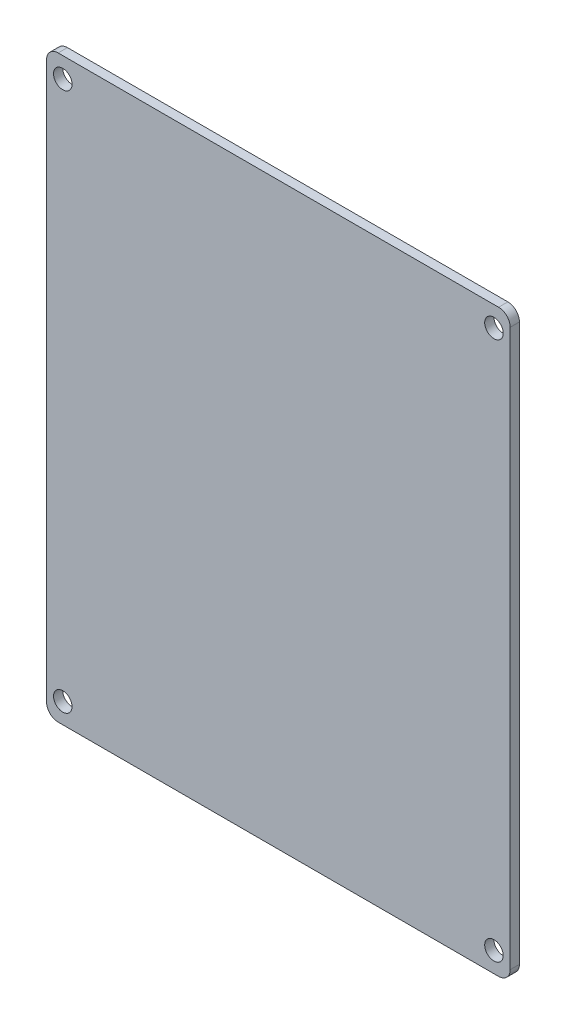
ISO-10303-21;
HEADER;
FILE_DESCRIPTION(('STEP AP214'),'2;1');
FILE_NAME('part.step','',(''),(''),'','','');
FILE_SCHEMA(('AUTOMOTIVE_DESIGN { 1 0 10303 214 1 1 1 1 }'));
ENDSEC;
DATA;
#1=APPLICATION_CONTEXT('core data for automotive mechanical design processes');
#2=APPLICATION_PROTOCOL_DEFINITION('international standard','automotive_design',2000,#1);
#3=PRODUCT_CONTEXT('',#1,'mechanical');
#4=PRODUCT('Part','Part','',(#3));
#5=PRODUCT_RELATED_PRODUCT_CATEGORY('part','',(#4));
#6=PRODUCT_DEFINITION_FORMATION('','',#4);
#7=PRODUCT_DEFINITION_CONTEXT('part definition',#1,'design');
#8=PRODUCT_DEFINITION('design','',#6,#7);
#9=PRODUCT_DEFINITION_SHAPE('','',#8);
#10=(LENGTH_UNIT() NAMED_UNIT(*) SI_UNIT(.MILLI.,.METRE.));
#11=(NAMED_UNIT(*) PLANE_ANGLE_UNIT() SI_UNIT($,.RADIAN.));
#12=(NAMED_UNIT(*) SI_UNIT($,.STERADIAN.) SOLID_ANGLE_UNIT());
#13=UNCERTAINTY_MEASURE_WITH_UNIT(LENGTH_MEASURE(1.E-05),#10,'distance_accuracy_value','');
#14=(GEOMETRIC_REPRESENTATION_CONTEXT(3) GLOBAL_UNCERTAINTY_ASSIGNED_CONTEXT((#13)) GLOBAL_UNIT_ASSIGNED_CONTEXT((#10,
#11,#12)) REPRESENTATION_CONTEXT('',''));
#15=CARTESIAN_POINT('',(0.,0.,0.));
#16=DIRECTION('',(0.,0.,1.));
#17=DIRECTION('',(1.,0.,0.));
#18=AXIS2_PLACEMENT_3D('',#15,#16,#17);
#19=CARTESIAN_POINT('',(0.,0.,1.6));
#20=DIRECTION('',(0.,0.,-1.));
#21=DIRECTION('',(-1.,0.,0.));
#22=AXIS2_PLACEMENT_3D('',#19,#20,#21);
#23=PLANE('',#22);
#24=DIRECTION('',(-1.,0.,0.));
#25=VECTOR('',#24,1.);
#26=CARTESIAN_POINT('',(-40.,50.,1.6));
#27=LINE('',#26,#25);
#28=CARTESIAN_POINT('',(38.,50.,1.6));
#29=VERTEX_POINT('',#28);
#30=CARTESIAN_POINT('',(-38.,50.,1.6));
#31=VERTEX_POINT('',#30);
#32=EDGE_CURVE('E182',#29,#31,#27,.T.);
#33=ORIENTED_EDGE('',*,*,#32,.T.);
#34=CARTESIAN_POINT('',(-38.,48.,1.6));
#35=DIRECTION('',(0.,0.,-1.));
#36=DIRECTION('',(-1.,0.,0.));
#37=AXIS2_PLACEMENT_3D('',#34,#35,#36);
#38=CIRCLE('',#37,2.);
#39=CARTESIAN_POINT('',(-40.,48.,1.6));
#40=VERTEX_POINT('',#39);
#41=EDGE_CURVE('E161',#31,#40,#38,.F.);
#42=ORIENTED_EDGE('',*,*,#41,.T.);
#43=DIRECTION('',(0.,-1.,0.));
#44=VECTOR('',#43,1.);
#45=CARTESIAN_POINT('',(-40.,-50.,1.6));
#46=LINE('',#45,#44);
#47=CARTESIAN_POINT('',(-40.,-48.,1.6));
#48=VERTEX_POINT('',#47);
#49=EDGE_CURVE('E128',#40,#48,#46,.T.);
#50=ORIENTED_EDGE('',*,*,#49,.T.);
#51=CARTESIAN_POINT('',(-38.,-48.,1.6));
#52=DIRECTION('',(0.,0.,-1.));
#53=DIRECTION('',(-1.,0.,0.));
#54=AXIS2_PLACEMENT_3D('',#51,#52,#53);
#55=CIRCLE('',#54,2.);
#56=CARTESIAN_POINT('',(-38.,-50.,1.6));
#57=VERTEX_POINT('',#56);
#58=EDGE_CURVE('E64',#48,#57,#55,.F.);
#59=ORIENTED_EDGE('',*,*,#58,.T.);
#60=DIRECTION('',(1.,0.,0.));
#61=VECTOR('',#60,1.);
#62=CARTESIAN_POINT('',(-40.,-50.,1.6));
#63=LINE('',#62,#61);
#64=CARTESIAN_POINT('',(38.,-50.,1.6));
#65=VERTEX_POINT('',#64);
#66=EDGE_CURVE('E144',#57,#65,#63,.T.);
#67=ORIENTED_EDGE('',*,*,#66,.T.);
#68=CARTESIAN_POINT('',(38.,-48.,1.6));
#69=DIRECTION('',(0.,0.,-1.));
#70=DIRECTION('',(-1.,0.,0.));
#71=AXIS2_PLACEMENT_3D('',#68,#69,#70);
#72=CIRCLE('',#71,2.);
#73=CARTESIAN_POINT('',(40.,-48.,1.6));
#74=VERTEX_POINT('',#73);
#75=EDGE_CURVE('E156',#65,#74,#72,.F.);
#76=ORIENTED_EDGE('',*,*,#75,.T.);
#77=DIRECTION('',(0.,1.,0.));
#78=VECTOR('',#77,1.);
#79=CARTESIAN_POINT('',(40.,-50.,1.6));
#80=LINE('',#79,#78);
#81=CARTESIAN_POINT('',(40.,48.,1.6));
#82=VERTEX_POINT('',#81);
#83=EDGE_CURVE('E138',#74,#82,#80,.T.);
#84=ORIENTED_EDGE('',*,*,#83,.T.);
#85=CARTESIAN_POINT('',(38.,48.,1.6));
#86=DIRECTION('',(0.,0.,-1.));
#87=DIRECTION('',(-1.,0.,0.));
#88=AXIS2_PLACEMENT_3D('',#85,#86,#87);
#89=CIRCLE('',#88,2.);
#90=EDGE_CURVE('E153',#82,#29,#89,.F.);
#91=ORIENTED_EDGE('',*,*,#90,.T.);
#92=EDGE_LOOP('',(#33,#42,#50,#59,#67,#76,#84,#91));
#93=FACE_BOUND('',#92,.T.);
#94=CARTESIAN_POINT('',(-37.2,46.5,1.6));
#95=DIRECTION('',(0.,0.,1.));
#96=DIRECTION('',(1.,0.,0.));
#97=AXIS2_PLACEMENT_3D('',#94,#95,#96);
#98=CIRCLE('',#97,1.6);
#99=CARTESIAN_POINT('',(-35.6,46.5,1.6));
#100=VERTEX_POINT('',#99);
#101=EDGE_CURVE('E187',#100,#100,#98,.T.);
#102=ORIENTED_EDGE('',*,*,#101,.F.);
#103=EDGE_LOOP('',(#102));
#104=FACE_BOUND('',#103,.T.);
#105=CARTESIAN_POINT('',(37.2,46.5,1.6));
#106=DIRECTION('',(0.,0.,1.));
#107=DIRECTION('',(-1.,0.,0.));
#108=AXIS2_PLACEMENT_3D('',#105,#106,#107);
#109=CIRCLE('',#108,1.6);
#110=CARTESIAN_POINT('',(35.6,46.5,1.6));
#111=VERTEX_POINT('',#110);
#112=EDGE_CURVE('E265',#111,#111,#109,.T.);
#113=ORIENTED_EDGE('',*,*,#112,.F.);
#114=EDGE_LOOP('',(#113));
#115=FACE_BOUND('',#114,.T.);
#116=CARTESIAN_POINT('',(37.2,-46.5,1.6));
#117=DIRECTION('',(0.,0.,1.));
#118=DIRECTION('',(1.,0.,0.));
#119=AXIS2_PLACEMENT_3D('',#116,#117,#118);
#120=CIRCLE('',#119,1.6);
#121=CARTESIAN_POINT('',(38.8,-46.5,1.6));
#122=VERTEX_POINT('',#121);
#123=EDGE_CURVE('E269',#122,#122,#120,.T.);
#124=ORIENTED_EDGE('',*,*,#123,.F.);
#125=EDGE_LOOP('',(#124));
#126=FACE_BOUND('',#125,.T.);
#127=CARTESIAN_POINT('',(-37.2,-46.5,1.6));
#128=DIRECTION('',(0.,0.,1.));
#129=DIRECTION('',(-1.,0.,0.));
#130=AXIS2_PLACEMENT_3D('',#127,#128,#129);
#131=CIRCLE('',#130,1.6);
#132=CARTESIAN_POINT('',(-38.8,-46.5,1.6));
#133=VERTEX_POINT('',#132);
#134=EDGE_CURVE('E284',#133,#133,#131,.T.);
#135=ORIENTED_EDGE('',*,*,#134,.F.);
#136=EDGE_LOOP('',(#135));
#137=FACE_BOUND('',#136,.T.);
#138=ADVANCED_FACE('F42',(#93,#104,#115,#126,#137),#23,.F.);
#139=CARTESIAN_POINT('',(0.,0.,0.));
#140=DIRECTION('',(0.,0.,-1.));
#141=DIRECTION('',(-1.,0.,0.));
#142=AXIS2_PLACEMENT_3D('',#139,#140,#141);
#143=PLANE('',#142);
#144=CARTESIAN_POINT('',(37.2,-46.5,0.));
#145=DIRECTION('',(0.,0.,1.));
#146=DIRECTION('',(1.,0.,0.));
#147=AXIS2_PLACEMENT_3D('',#144,#145,#146);
#148=CIRCLE('',#147,1.6);
#149=CARTESIAN_POINT('',(38.8,-46.5,0.));
#150=VERTEX_POINT('',#149);
#151=EDGE_CURVE('E275',#150,#150,#148,.T.);
#152=ORIENTED_EDGE('',*,*,#151,.T.);
#153=EDGE_LOOP('',(#152));
#154=FACE_BOUND('',#153,.T.);
#155=CARTESIAN_POINT('',(-37.2,46.5,0.));
#156=DIRECTION('',(0.,0.,1.));
#157=DIRECTION('',(1.,0.,0.));
#158=AXIS2_PLACEMENT_3D('',#155,#156,#157);
#159=CIRCLE('',#158,1.6);
#160=CARTESIAN_POINT('',(-35.6,46.5,0.));
#161=VERTEX_POINT('',#160);
#162=EDGE_CURVE('E190',#161,#161,#159,.T.);
#163=ORIENTED_EDGE('',*,*,#162,.T.);
#164=EDGE_LOOP('',(#163));
#165=FACE_BOUND('',#164,.T.);
#166=DIRECTION('',(0.,-1.,0.));
#167=VECTOR('',#166,1.);
#168=CARTESIAN_POINT('',(-40.,-50.,0.));
#169=LINE('',#168,#167);
#170=CARTESIAN_POINT('',(-40.,48.,0.));
#171=VERTEX_POINT('',#170);
#172=CARTESIAN_POINT('',(-40.,-48.,0.));
#173=VERTEX_POINT('',#172);
#174=EDGE_CURVE('E126',#171,#173,#169,.T.);
#175=ORIENTED_EDGE('',*,*,#174,.F.);
#176=CARTESIAN_POINT('',(-38.,48.,0.));
#177=DIRECTION('',(0.,0.,-1.));
#178=DIRECTION('',(-1.,0.,0.));
#179=AXIS2_PLACEMENT_3D('',#176,#177,#178);
#180=CIRCLE('',#179,2.);
#181=CARTESIAN_POINT('',(-38.,50.,0.));
#182=VERTEX_POINT('',#181);
#183=EDGE_CURVE('E109',#171,#182,#180,.T.);
#184=ORIENTED_EDGE('',*,*,#183,.T.);
#185=DIRECTION('',(-1.,0.,0.));
#186=VECTOR('',#185,1.);
#187=CARTESIAN_POINT('',(-40.,50.,0.));
#188=LINE('',#187,#186);
#189=CARTESIAN_POINT('',(38.,50.,0.));
#190=VERTEX_POINT('',#189);
#191=EDGE_CURVE('E136',#190,#182,#188,.T.);
#192=ORIENTED_EDGE('',*,*,#191,.F.);
#193=CARTESIAN_POINT('',(38.,48.,0.));
#194=DIRECTION('',(0.,0.,-1.));
#195=DIRECTION('',(-1.,0.,0.));
#196=AXIS2_PLACEMENT_3D('',#193,#194,#195);
#197=CIRCLE('',#196,2.);
#198=CARTESIAN_POINT('',(40.,48.,0.));
#199=VERTEX_POINT('',#198);
#200=EDGE_CURVE('E129',#190,#199,#197,.T.);
#201=ORIENTED_EDGE('',*,*,#200,.T.);
#202=DIRECTION('',(0.,1.,0.));
#203=VECTOR('',#202,1.);
#204=CARTESIAN_POINT('',(40.,-50.,0.));
#205=LINE('',#204,#203);
#206=CARTESIAN_POINT('',(40.,-48.,0.));
#207=VERTEX_POINT('',#206);
#208=EDGE_CURVE('E140',#207,#199,#205,.T.);
#209=ORIENTED_EDGE('',*,*,#208,.F.);
#210=CARTESIAN_POINT('',(38.,-48.,0.));
#211=DIRECTION('',(0.,0.,-1.));
#212=DIRECTION('',(-1.,0.,0.));
#213=AXIS2_PLACEMENT_3D('',#210,#211,#212);
#214=CIRCLE('',#213,2.);
#215=CARTESIAN_POINT('',(38.,-50.,0.));
#216=VERTEX_POINT('',#215);
#217=EDGE_CURVE('E147',#207,#216,#214,.T.);
#218=ORIENTED_EDGE('',*,*,#217,.T.);
#219=DIRECTION('',(1.,0.,0.));
#220=VECTOR('',#219,1.);
#221=CARTESIAN_POINT('',(-40.,-50.,0.));
#222=LINE('',#221,#220);
#223=CARTESIAN_POINT('',(-38.,-50.,0.));
#224=VERTEX_POINT('',#223);
#225=EDGE_CURVE('E135',#224,#216,#222,.T.);
#226=ORIENTED_EDGE('',*,*,#225,.F.);
#227=CARTESIAN_POINT('',(-38.,-48.,0.));
#228=DIRECTION('',(0.,0.,-1.));
#229=DIRECTION('',(-1.,0.,0.));
#230=AXIS2_PLACEMENT_3D('',#227,#228,#229);
#231=CIRCLE('',#230,2.);
#232=EDGE_CURVE('E120',#224,#173,#231,.T.);
#233=ORIENTED_EDGE('',*,*,#232,.T.);
#234=EDGE_LOOP('',(#175,#184,#192,#201,#209,#218,#226,#233));
#235=FACE_BOUND('',#234,.T.);
#236=CARTESIAN_POINT('',(37.2,46.5,0.));
#237=DIRECTION('',(0.,0.,1.));
#238=DIRECTION('',(-1.,0.,0.));
#239=AXIS2_PLACEMENT_3D('',#236,#237,#238);
#240=CIRCLE('',#239,1.6);
#241=CARTESIAN_POINT('',(35.6,46.5,0.));
#242=VERTEX_POINT('',#241);
#243=EDGE_CURVE('E268',#242,#242,#240,.T.);
#244=ORIENTED_EDGE('',*,*,#243,.T.);
#245=EDGE_LOOP('',(#244));
#246=FACE_BOUND('',#245,.T.);
#247=CARTESIAN_POINT('',(-37.2,-46.5,0.));
#248=DIRECTION('',(0.,0.,1.));
#249=DIRECTION('',(-1.,0.,0.));
#250=AXIS2_PLACEMENT_3D('',#247,#248,#249);
#251=CIRCLE('',#250,1.6);
#252=CARTESIAN_POINT('',(-38.8,-46.5,0.));
#253=VERTEX_POINT('',#252);
#254=EDGE_CURVE('E282',#253,#253,#251,.T.);
#255=ORIENTED_EDGE('',*,*,#254,.T.);
#256=EDGE_LOOP('',(#255));
#257=FACE_BOUND('',#256,.T.);
#258=ADVANCED_FACE('F132',(#154,#165,#235,#246,#257),#143,.T.);
#259=CARTESIAN_POINT('',(40.,-50.,1.6));
#260=DIRECTION('',(-1.,0.,0.));
#261=DIRECTION('',(0.,0.,1.));
#262=AXIS2_PLACEMENT_3D('',#259,#260,#261);
#263=PLANE('',#262);
#264=ORIENTED_EDGE('',*,*,#83,.F.);
#265=DIRECTION('',(0.,0.,-1.));
#266=VECTOR('',#265,1.);
#267=CARTESIAN_POINT('',(40.,-48.,1.6));
#268=LINE('',#267,#266);
#269=EDGE_CURVE('E12',#74,#207,#268,.T.);
#270=ORIENTED_EDGE('',*,*,#269,.T.);
#271=ORIENTED_EDGE('',*,*,#208,.T.);
#272=DIRECTION('',(0.,0.,-1.));
#273=VECTOR('',#272,1.);
#274=CARTESIAN_POINT('',(40.,48.,1.6));
#275=LINE('',#274,#273);
#276=EDGE_CURVE('E50',#199,#82,#275,.F.);
#277=ORIENTED_EDGE('',*,*,#276,.T.);
#278=EDGE_LOOP('',(#264,#270,#271,#277));
#279=FACE_BOUND('',#278,.T.);
#280=ADVANCED_FACE('F172',(#279),#263,.F.);
#281=CARTESIAN_POINT('',(-40.,50.,1.6));
#282=DIRECTION('',(0.,-1.,0.));
#283=DIRECTION('',(0.,0.,-1.));
#284=AXIS2_PLACEMENT_3D('',#281,#282,#283);
#285=PLANE('',#284);
#286=ORIENTED_EDGE('',*,*,#191,.T.);
#287=DIRECTION('',(0.,0.,-1.));
#288=VECTOR('',#287,1.);
#289=CARTESIAN_POINT('',(-38.,50.,1.6));
#290=LINE('',#289,#288);
#291=EDGE_CURVE('E114',#182,#31,#290,.F.);
#292=ORIENTED_EDGE('',*,*,#291,.T.);
#293=ORIENTED_EDGE('',*,*,#32,.F.);
#294=DIRECTION('',(0.,0.,-1.));
#295=VECTOR('',#294,1.);
#296=CARTESIAN_POINT('',(38.,50.,1.6));
#297=LINE('',#296,#295);
#298=EDGE_CURVE('E119',#29,#190,#297,.T.);
#299=ORIENTED_EDGE('',*,*,#298,.T.);
#300=EDGE_LOOP('',(#286,#292,#293,#299));
#301=FACE_BOUND('',#300,.T.);
#302=ADVANCED_FACE('F186',(#301),#285,.F.);
#303=CARTESIAN_POINT('',(-40.,-50.,1.6));
#304=DIRECTION('',(1.,0.,0.));
#305=DIRECTION('',(0.,0.,-1.));
#306=AXIS2_PLACEMENT_3D('',#303,#304,#305);
#307=PLANE('',#306);
#308=ORIENTED_EDGE('',*,*,#49,.F.);
#309=DIRECTION('',(0.,0.,-1.));
#310=VECTOR('',#309,1.);
#311=CARTESIAN_POINT('',(-40.,48.,1.6));
#312=LINE('',#311,#310);
#313=EDGE_CURVE('E113',#40,#171,#312,.T.);
#314=ORIENTED_EDGE('',*,*,#313,.T.);
#315=ORIENTED_EDGE('',*,*,#174,.T.);
#316=DIRECTION('',(0.,0.,-1.));
#317=VECTOR('',#316,1.);
#318=CARTESIAN_POINT('',(-40.,-48.,1.6));
#319=LINE('',#318,#317);
#320=EDGE_CURVE('E130',#173,#48,#319,.F.);
#321=ORIENTED_EDGE('',*,*,#320,.T.);
#322=EDGE_LOOP('',(#308,#314,#315,#321));
#323=FACE_BOUND('',#322,.T.);
#324=ADVANCED_FACE('F125',(#323),#307,.F.);
#325=CARTESIAN_POINT('',(-40.,-50.,1.6));
#326=DIRECTION('',(0.,1.,0.));
#327=DIRECTION('',(0.,0.,1.));
#328=AXIS2_PLACEMENT_3D('',#325,#326,#327);
#329=PLANE('',#328);
#330=ORIENTED_EDGE('',*,*,#66,.F.);
#331=DIRECTION('',(0.,0.,-1.));
#332=VECTOR('',#331,1.);
#333=CARTESIAN_POINT('',(-38.,-50.,1.6));
#334=LINE('',#333,#332);
#335=EDGE_CURVE('E165',#57,#224,#334,.T.);
#336=ORIENTED_EDGE('',*,*,#335,.T.);
#337=ORIENTED_EDGE('',*,*,#225,.T.);
#338=DIRECTION('',(0.,0.,-1.));
#339=VECTOR('',#338,1.);
#340=CARTESIAN_POINT('',(38.,-50.,1.6));
#341=LINE('',#340,#339);
#342=EDGE_CURVE('E57',#216,#65,#341,.F.);
#343=ORIENTED_EDGE('',*,*,#342,.T.);
#344=EDGE_LOOP('',(#330,#336,#337,#343));
#345=FACE_BOUND('',#344,.T.);
#346=ADVANCED_FACE('F212',(#345),#329,.F.);
#347=CARTESIAN_POINT('',(-37.2,46.5,1.6));
#348=DIRECTION('',(0.,0.,-1.));
#349=DIRECTION('',(-1.,0.,0.));
#350=AXIS2_PLACEMENT_3D('',#347,#348,#349);
#351=CYLINDRICAL_SURFACE('',#350,1.6);
#352=ORIENTED_EDGE('',*,*,#101,.T.);
#353=EDGE_LOOP('',(#352));
#354=FACE_BOUND('',#353,.T.);
#355=ORIENTED_EDGE('',*,*,#162,.F.);
#356=EDGE_LOOP('',(#355));
#357=FACE_BOUND('',#356,.T.);
#358=ADVANCED_FACE('F229',(#354,#357),#351,.F.);
#359=CARTESIAN_POINT('',(37.2,46.5,1.6));
#360=DIRECTION('',(0.,0.,-1.));
#361=DIRECTION('',(-1.,0.,0.));
#362=AXIS2_PLACEMENT_3D('',#359,#360,#361);
#363=CYLINDRICAL_SURFACE('',#362,1.6);
#364=ORIENTED_EDGE('',*,*,#112,.T.);
#365=EDGE_LOOP('',(#364));
#366=FACE_BOUND('',#365,.T.);
#367=ORIENTED_EDGE('',*,*,#243,.F.);
#368=EDGE_LOOP('',(#367));
#369=FACE_BOUND('',#368,.T.);
#370=ADVANCED_FACE('F251',(#366,#369),#363,.F.);
#371=CARTESIAN_POINT('',(37.2,-46.5,1.6));
#372=DIRECTION('',(0.,0.,-1.));
#373=DIRECTION('',(-1.,0.,0.));
#374=AXIS2_PLACEMENT_3D('',#371,#372,#373);
#375=CYLINDRICAL_SURFACE('',#374,1.6);
#376=ORIENTED_EDGE('',*,*,#123,.T.);
#377=EDGE_LOOP('',(#376));
#378=FACE_BOUND('',#377,.T.);
#379=ORIENTED_EDGE('',*,*,#151,.F.);
#380=EDGE_LOOP('',(#379));
#381=FACE_BOUND('',#380,.T.);
#382=ADVANCED_FACE('F245',(#378,#381),#375,.F.);
#383=CARTESIAN_POINT('',(-37.2,-46.5,1.6));
#384=DIRECTION('',(0.,0.,-1.));
#385=DIRECTION('',(-1.,0.,0.));
#386=AXIS2_PLACEMENT_3D('',#383,#384,#385);
#387=CYLINDRICAL_SURFACE('',#386,1.6);
#388=ORIENTED_EDGE('',*,*,#134,.T.);
#389=EDGE_LOOP('',(#388));
#390=FACE_BOUND('',#389,.T.);
#391=ORIENTED_EDGE('',*,*,#254,.F.);
#392=EDGE_LOOP('',(#391));
#393=FACE_BOUND('',#392,.T.);
#394=ADVANCED_FACE('F241',(#390,#393),#387,.F.);
#395=CARTESIAN_POINT('',(-38.,48.,1.6));
#396=DIRECTION('',(0.,0.,-1.));
#397=DIRECTION('',(-1.,0.,0.));
#398=AXIS2_PLACEMENT_3D('',#395,#396,#397);
#399=CYLINDRICAL_SURFACE('',#398,2.);
#400=ORIENTED_EDGE('',*,*,#41,.F.);
#401=ORIENTED_EDGE('',*,*,#291,.F.);
#402=ORIENTED_EDGE('',*,*,#183,.F.);
#403=ORIENTED_EDGE('',*,*,#313,.F.);
#404=EDGE_LOOP('',(#400,#401,#402,#403));
#405=FACE_BOUND('',#404,.T.);
#406=ADVANCED_FACE('F112',(#405),#399,.T.);
#407=CARTESIAN_POINT('',(-38.,-48.,1.6));
#408=DIRECTION('',(0.,0.,-1.));
#409=DIRECTION('',(-1.,0.,0.));
#410=AXIS2_PLACEMENT_3D('',#407,#408,#409);
#411=CYLINDRICAL_SURFACE('',#410,2.);
#412=ORIENTED_EDGE('',*,*,#58,.F.);
#413=ORIENTED_EDGE('',*,*,#320,.F.);
#414=ORIENTED_EDGE('',*,*,#232,.F.);
#415=ORIENTED_EDGE('',*,*,#335,.F.);
#416=EDGE_LOOP('',(#412,#413,#414,#415));
#417=FACE_BOUND('',#416,.T.);
#418=ADVANCED_FACE('F211',(#417),#411,.T.);
#419=CARTESIAN_POINT('',(38.,-48.,1.6));
#420=DIRECTION('',(0.,0.,-1.));
#421=DIRECTION('',(-1.,0.,0.));
#422=AXIS2_PLACEMENT_3D('',#419,#420,#421);
#423=CYLINDRICAL_SURFACE('',#422,2.);
#424=ORIENTED_EDGE('',*,*,#75,.F.);
#425=ORIENTED_EDGE('',*,*,#342,.F.);
#426=ORIENTED_EDGE('',*,*,#217,.F.);
#427=ORIENTED_EDGE('',*,*,#269,.F.);
#428=EDGE_LOOP('',(#424,#425,#426,#427));
#429=FACE_BOUND('',#428,.T.);
#430=ADVANCED_FACE('F214',(#429),#423,.T.);
#431=CARTESIAN_POINT('',(38.,48.,1.6));
#432=DIRECTION('',(0.,0.,-1.));
#433=DIRECTION('',(-1.,0.,0.));
#434=AXIS2_PLACEMENT_3D('',#431,#432,#433);
#435=CYLINDRICAL_SURFACE('',#434,2.);
#436=ORIENTED_EDGE('',*,*,#90,.F.);
#437=ORIENTED_EDGE('',*,*,#276,.F.);
#438=ORIENTED_EDGE('',*,*,#200,.F.);
#439=ORIENTED_EDGE('',*,*,#298,.F.);
#440=EDGE_LOOP('',(#436,#437,#438,#439));
#441=FACE_BOUND('',#440,.T.);
#442=ADVANCED_FACE('F44',(#441),#435,.T.);
#443=CLOSED_SHELL('',(#138,#258,#280,#302,#324,#346,#358,#370,#382,#394,#406,#418,#430,#442));
#444=MANIFOLD_SOLID_BREP('B2',#443);
#445=ADVANCED_BREP_SHAPE_REPRESENTATION('',(#18,#444),#14);
#446=SHAPE_DEFINITION_REPRESENTATION(#9,#445);
ENDSEC;
END-ISO-10303-21;
